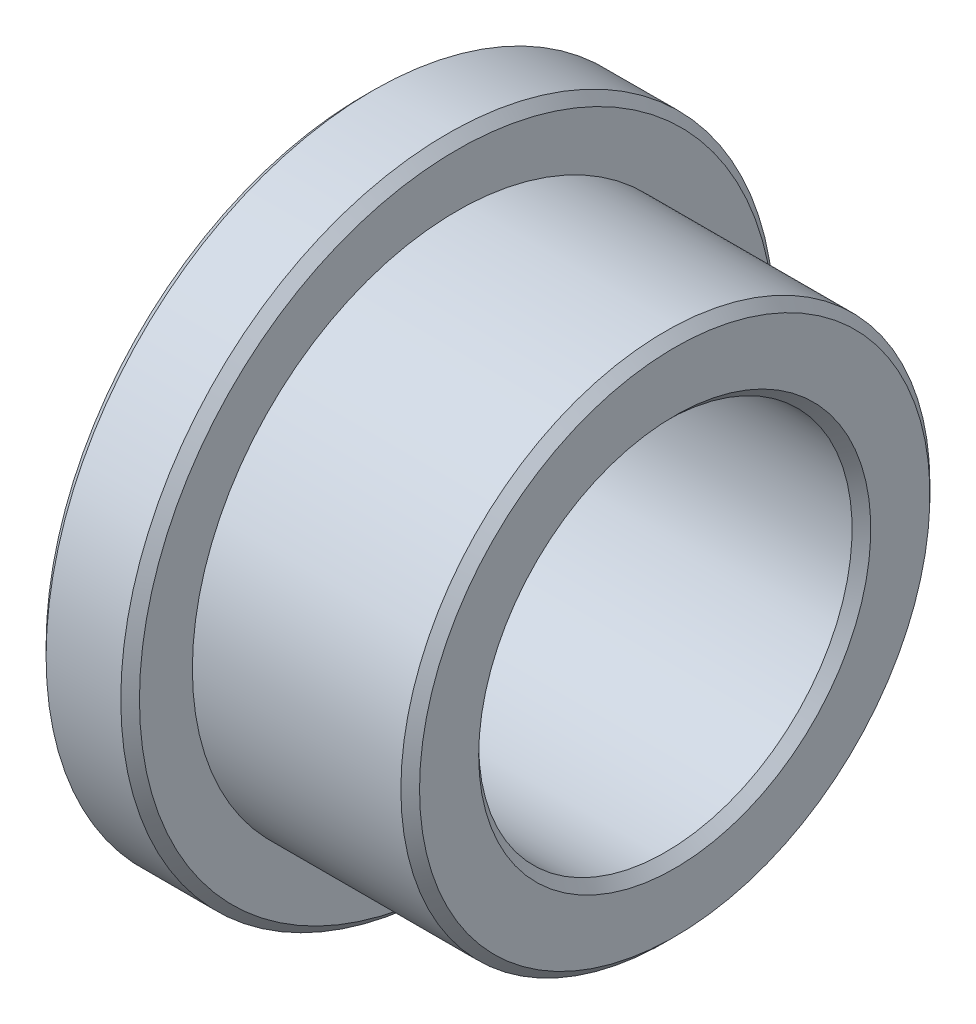
ISO-10303-21;
HEADER;
FILE_DESCRIPTION(('STEP AP214'),'2;1');
FILE_NAME('part.step','',(''),(''),'','','');
FILE_SCHEMA(('AUTOMOTIVE_DESIGN { 1 0 10303 214 1 1 1 1 }'));
ENDSEC;
DATA;
#1=APPLICATION_CONTEXT('core data for automotive mechanical design processes');
#2=APPLICATION_PROTOCOL_DEFINITION('international standard','automotive_design',2000,#1);
#3=PRODUCT_CONTEXT('',#1,'mechanical');
#4=PRODUCT('Part','Part','',(#3));
#5=PRODUCT_RELATED_PRODUCT_CATEGORY('part','',(#4));
#6=PRODUCT_DEFINITION_FORMATION('','',#4);
#7=PRODUCT_DEFINITION_CONTEXT('part definition',#1,'design');
#8=PRODUCT_DEFINITION('design','',#6,#7);
#9=PRODUCT_DEFINITION_SHAPE('','',#8);
#10=(LENGTH_UNIT() NAMED_UNIT(*) SI_UNIT(.MILLI.,.METRE.));
#11=(NAMED_UNIT(*) PLANE_ANGLE_UNIT() SI_UNIT($,.RADIAN.));
#12=(NAMED_UNIT(*) SI_UNIT($,.STERADIAN.) SOLID_ANGLE_UNIT());
#13=UNCERTAINTY_MEASURE_WITH_UNIT(LENGTH_MEASURE(1.E-05),#10,'distance_accuracy_value','');
#14=(GEOMETRIC_REPRESENTATION_CONTEXT(3) GLOBAL_UNCERTAINTY_ASSIGNED_CONTEXT((#13)) GLOBAL_UNIT_ASSIGNED_CONTEXT((#10,
#11,#12)) REPRESENTATION_CONTEXT('',''));
#15=CARTESIAN_POINT('',(0.,0.,0.));
#16=DIRECTION('',(0.,0.,1.));
#17=DIRECTION('',(1.,0.,0.));
#18=AXIS2_PLACEMENT_3D('',#15,#16,#17);
#19=CARTESIAN_POINT('',(0.,0.,0.));
#20=DIRECTION('',(-1.,0.,0.));
#21=DIRECTION('',(0.,0.,1.));
#22=AXIS2_PLACEMENT_3D('',#19,#20,#21);
#23=CYLINDRICAL_SURFACE('',#22,6.);
#24=CARTESIAN_POINT('',(0.299999999999994,0.,0.));
#25=DIRECTION('',(1.,0.,0.));
#26=DIRECTION('',(0.,0.,-1.));
#27=AXIS2_PLACEMENT_3D('',#24,#25,#26);
#28=CIRCLE('',#27,6.);
#29=CARTESIAN_POINT('',(0.299999999999994,0.,-6.));
#30=VERTEX_POINT('',#29);
#31=EDGE_CURVE('E59',#30,#30,#28,.F.);
#32=ORIENTED_EDGE('',*,*,#31,.T.);
#33=EDGE_LOOP('',(#32));
#34=FACE_BOUND('',#33,.T.);
#35=CARTESIAN_POINT('',(9.7,0.,0.));
#36=DIRECTION('',(-1.,0.,0.));
#37=DIRECTION('',(0.,0.,1.));
#38=AXIS2_PLACEMENT_3D('',#35,#36,#37);
#39=CIRCLE('',#38,6.);
#40=CARTESIAN_POINT('',(9.7,0.,6.));
#41=VERTEX_POINT('',#40);
#42=EDGE_CURVE('E62',#41,#41,#39,.F.);
#43=ORIENTED_EDGE('',*,*,#42,.T.);
#44=EDGE_LOOP('',(#43));
#45=FACE_BOUND('',#44,.T.);
#46=ADVANCED_FACE('F35',(#34,#45),#23,.F.);
#47=CARTESIAN_POINT('',(0.,6.,0.));
#48=DIRECTION('',(1.,0.,0.));
#49=DIRECTION('',(0.,0.,-1.));
#50=AXIS2_PLACEMENT_3D('',#47,#48,#49);
#51=PLANE('',#50);
#52=CARTESIAN_POINT('',(0.,0.,0.));
#53=DIRECTION('',(1.,0.,0.));
#54=DIRECTION('',(0.,0.,-1.));
#55=AXIS2_PLACEMENT_3D('',#52,#53,#54);
#56=CIRCLE('',#55,6.29999999999999);
#57=CARTESIAN_POINT('',(0.,0.,-6.29999999999999));
#58=VERTEX_POINT('',#57);
#59=EDGE_CURVE('E51',#58,#58,#56,.T.);
#60=ORIENTED_EDGE('',*,*,#59,.T.);
#61=EDGE_LOOP('',(#60));
#62=FACE_BOUND('',#61,.T.);
#63=CARTESIAN_POINT('',(0.,0.,0.));
#64=DIRECTION('',(1.,0.,0.));
#65=DIRECTION('',(0.,0.,-1.));
#66=AXIS2_PLACEMENT_3D('',#63,#64,#65);
#67=CIRCLE('',#66,10.2);
#68=CARTESIAN_POINT('',(0.,0.,-10.2));
#69=VERTEX_POINT('',#68);
#70=EDGE_CURVE('E56',#69,#69,#67,.F.);
#71=ORIENTED_EDGE('',*,*,#70,.T.);
#72=EDGE_LOOP('',(#71));
#73=FACE_BOUND('',#72,.T.);
#74=ADVANCED_FACE('F95',(#62,#73),#51,.F.);
#75=CARTESIAN_POINT('',(0.,0.,0.));
#76=DIRECTION('',(-1.,0.,0.));
#77=DIRECTION('',(0.,0.,1.));
#78=AXIS2_PLACEMENT_3D('',#75,#76,#77);
#79=CYLINDRICAL_SURFACE('',#78,10.5);
#80=CARTESIAN_POINT('',(2.70000000000001,0.,0.));
#81=DIRECTION('',(-1.,0.,0.));
#82=DIRECTION('',(0.,0.,1.));
#83=AXIS2_PLACEMENT_3D('',#80,#81,#82);
#84=CIRCLE('',#83,10.5);
#85=CARTESIAN_POINT('',(2.70000000000001,0.,10.5));
#86=VERTEX_POINT('',#85);
#87=EDGE_CURVE('E43',#86,#86,#84,.T.);
#88=ORIENTED_EDGE('',*,*,#87,.T.);
#89=EDGE_LOOP('',(#88));
#90=FACE_BOUND('',#89,.T.);
#91=CARTESIAN_POINT('',(0.300000000000005,0.,0.));
#92=DIRECTION('',(1.,0.,0.));
#93=DIRECTION('',(0.,0.,-1.));
#94=AXIS2_PLACEMENT_3D('',#91,#92,#93);
#95=CIRCLE('',#94,10.5);
#96=CARTESIAN_POINT('',(0.300000000000005,0.,-10.5));
#97=VERTEX_POINT('',#96);
#98=EDGE_CURVE('E47',#97,#97,#95,.T.);
#99=ORIENTED_EDGE('',*,*,#98,.T.);
#100=EDGE_LOOP('',(#99));
#101=FACE_BOUND('',#100,.T.);
#102=ADVANCED_FACE('F92',(#90,#101),#79,.T.);
#103=CARTESIAN_POINT('',(3.,10.5,0.));
#104=DIRECTION('',(-1.,0.,0.));
#105=DIRECTION('',(0.,0.,1.));
#106=AXIS2_PLACEMENT_3D('',#103,#104,#105);
#107=PLANE('',#106);
#108=CARTESIAN_POINT('',(3.,0.,0.));
#109=DIRECTION('',(-1.,0.,0.));
#110=DIRECTION('',(0.,0.,1.));
#111=AXIS2_PLACEMENT_3D('',#108,#109,#110);
#112=CIRCLE('',#111,10.2);
#113=CARTESIAN_POINT('',(3.,0.,10.2));
#114=VERTEX_POINT('',#113);
#115=EDGE_CURVE('E10',#114,#114,#112,.F.);
#116=ORIENTED_EDGE('',*,*,#115,.T.);
#117=EDGE_LOOP('',(#116));
#118=FACE_BOUND('',#117,.T.);
#119=CARTESIAN_POINT('',(3.,0.,0.));
#120=DIRECTION('',(-1.,0.,0.));
#121=DIRECTION('',(0.,0.,1.));
#122=AXIS2_PLACEMENT_3D('',#119,#120,#121);
#123=CIRCLE('',#122,8.5);
#124=CARTESIAN_POINT('',(3.,0.,8.5));
#125=VERTEX_POINT('',#124);
#126=EDGE_CURVE('E74',#125,#125,#123,.T.);
#127=ORIENTED_EDGE('',*,*,#126,.T.);
#128=EDGE_LOOP('',(#127));
#129=FACE_BOUND('',#128,.T.);
#130=ADVANCED_FACE('F78',(#118,#129),#107,.F.);
#131=CARTESIAN_POINT('',(0.,0.,0.));
#132=DIRECTION('',(-1.,0.,0.));
#133=DIRECTION('',(0.,0.,1.));
#134=AXIS2_PLACEMENT_3D('',#131,#132,#133);
#135=CYLINDRICAL_SURFACE('',#134,8.5);
#136=CARTESIAN_POINT('',(9.70000000000001,0.,0.));
#137=DIRECTION('',(-1.,0.,0.));
#138=DIRECTION('',(0.,0.,1.));
#139=AXIS2_PLACEMENT_3D('',#136,#137,#138);
#140=CIRCLE('',#139,8.5);
#141=CARTESIAN_POINT('',(9.70000000000001,0.,8.5));
#142=VERTEX_POINT('',#141);
#143=EDGE_CURVE('E71',#142,#142,#140,.T.);
#144=ORIENTED_EDGE('',*,*,#143,.T.);
#145=EDGE_LOOP('',(#144));
#146=FACE_BOUND('',#145,.T.);
#147=ORIENTED_EDGE('',*,*,#126,.F.);
#148=EDGE_LOOP('',(#147));
#149=FACE_BOUND('',#148,.T.);
#150=ADVANCED_FACE('F80',(#146,#149),#135,.T.);
#151=CARTESIAN_POINT('',(10.,8.5,0.));
#152=DIRECTION('',(-1.,0.,0.));
#153=DIRECTION('',(0.,0.,1.));
#154=AXIS2_PLACEMENT_3D('',#151,#152,#153);
#155=PLANE('',#154);
#156=CARTESIAN_POINT('',(10.,0.,0.));
#157=DIRECTION('',(-1.,0.,0.));
#158=DIRECTION('',(0.,0.,1.));
#159=AXIS2_PLACEMENT_3D('',#156,#157,#158);
#160=CIRCLE('',#159,8.2);
#161=CARTESIAN_POINT('',(10.,0.,8.2));
#162=VERTEX_POINT('',#161);
#163=EDGE_CURVE('E65',#162,#162,#160,.F.);
#164=ORIENTED_EDGE('',*,*,#163,.T.);
#165=EDGE_LOOP('',(#164));
#166=FACE_BOUND('',#165,.T.);
#167=CARTESIAN_POINT('',(10.,0.,0.));
#168=DIRECTION('',(-1.,0.,0.));
#169=DIRECTION('',(0.,0.,1.));
#170=AXIS2_PLACEMENT_3D('',#167,#168,#169);
#171=CIRCLE('',#170,6.3);
#172=CARTESIAN_POINT('',(10.,0.,6.3));
#173=VERTEX_POINT('',#172);
#174=EDGE_CURVE('E68',#173,#173,#171,.T.);
#175=ORIENTED_EDGE('',*,*,#174,.T.);
#176=EDGE_LOOP('',(#175));
#177=FACE_BOUND('',#176,.T.);
#178=ADVANCED_FACE('F82',(#166,#177),#155,.F.);
#179=CARTESIAN_POINT('',(9.70000000000001,0.,0.));
#180=DIRECTION('',(-1.,0.,0.));
#181=DIRECTION('',(0.,0.,1.));
#182=AXIS2_PLACEMENT_3D('',#179,#180,#181);
#183=CONICAL_SURFACE('',#182,8.5,0.785398163397451);
#184=ORIENTED_EDGE('',*,*,#163,.F.);
#185=EDGE_LOOP('',(#184));
#186=FACE_BOUND('',#185,.T.);
#187=ORIENTED_EDGE('',*,*,#143,.F.);
#188=EDGE_LOOP('',(#187));
#189=FACE_BOUND('',#188,.T.);
#190=ADVANCED_FACE('F89',(#186,#189),#183,.T.);
#191=CARTESIAN_POINT('',(0.299999999999994,0.,0.));
#192=DIRECTION('',(-1.,0.,0.));
#193=DIRECTION('',(0.,0.,1.));
#194=AXIS2_PLACEMENT_3D('',#191,#192,#193);
#195=CONICAL_SURFACE('',#194,6.,0.785398163397448);
#196=ORIENTED_EDGE('',*,*,#59,.F.);
#197=EDGE_LOOP('',(#196));
#198=FACE_BOUND('',#197,.T.);
#199=ORIENTED_EDGE('',*,*,#31,.F.);
#200=EDGE_LOOP('',(#199));
#201=FACE_BOUND('',#200,.T.);
#202=ADVANCED_FACE('F112',(#198,#201),#195,.F.);
#203=CARTESIAN_POINT('',(10.,0.,0.));
#204=DIRECTION('',(1.,0.,0.));
#205=DIRECTION('',(0.,0.,-1.));
#206=AXIS2_PLACEMENT_3D('',#203,#204,#205);
#207=CONICAL_SURFACE('',#206,6.3,0.785398163397447);
#208=ORIENTED_EDGE('',*,*,#42,.F.);
#209=EDGE_LOOP('',(#208));
#210=FACE_BOUND('',#209,.T.);
#211=ORIENTED_EDGE('',*,*,#174,.F.);
#212=EDGE_LOOP('',(#211));
#213=FACE_BOUND('',#212,.T.);
#214=ADVANCED_FACE('F119',(#210,#213),#207,.F.);
#215=CARTESIAN_POINT('',(2.70000000000001,0.,0.));
#216=DIRECTION('',(-1.,0.,0.));
#217=DIRECTION('',(0.,0.,1.));
#218=AXIS2_PLACEMENT_3D('',#215,#216,#217);
#219=CONICAL_SURFACE('',#218,10.5,0.785398163397454);
#220=ORIENTED_EDGE('',*,*,#115,.F.);
#221=EDGE_LOOP('',(#220));
#222=FACE_BOUND('',#221,.T.);
#223=ORIENTED_EDGE('',*,*,#87,.F.);
#224=EDGE_LOOP('',(#223));
#225=FACE_BOUND('',#224,.T.);
#226=ADVANCED_FACE('F125',(#222,#225),#219,.T.);
#227=CARTESIAN_POINT('',(0.,0.,0.));
#228=DIRECTION('',(1.,0.,0.));
#229=DIRECTION('',(0.,0.,-1.));
#230=AXIS2_PLACEMENT_3D('',#227,#228,#229);
#231=CONICAL_SURFACE('',#230,10.2,0.785398163397443);
#232=CARTESIAN_POINT('',(0.300000000000005,0.,-10.5));
#233=CARTESIAN_POINT('',(0.296875000000006,0.,-10.496875));
#234=CARTESIAN_POINT('',(0.293750000000005,0.,-10.49375));
#235=CARTESIAN_POINT('',(0.287500000000005,0.,-10.4875));
#236=CARTESIAN_POINT('',(0.284375000000005,0.,-10.484375));
#237=CARTESIAN_POINT('',(0.278125000000005,0.,-10.478125));
#238=CARTESIAN_POINT('',(0.275000000000005,0.,-10.475));
#239=CARTESIAN_POINT('',(0.268750000000005,0.,-10.46875));
#240=CARTESIAN_POINT('',(0.265625000000004,0.,-10.465625));
#241=CARTESIAN_POINT('',(0.259375000000004,0.,-10.459375));
#242=CARTESIAN_POINT('',(0.256250000000004,0.,-10.45625));
#243=CARTESIAN_POINT('',(0.250000000000004,0.,-10.45));
#244=CARTESIAN_POINT('',(0.246875000000004,0.,-10.446875));
#245=CARTESIAN_POINT('',(0.240625000000004,0.,-10.440625));
#246=CARTESIAN_POINT('',(0.237500000000004,0.,-10.4375));
#247=CARTESIAN_POINT('',(0.231250000000004,0.,-10.43125));
#248=CARTESIAN_POINT('',(0.228125000000004,0.,-10.428125));
#249=CARTESIAN_POINT('',(0.221875000000004,0.,-10.421875));
#250=CARTESIAN_POINT('',(0.218750000000004,0.,-10.41875));
#251=CARTESIAN_POINT('',(0.212500000000004,0.,-10.4125));
#252=CARTESIAN_POINT('',(0.209375000000003,0.,-10.409375));
#253=CARTESIAN_POINT('',(0.203125000000003,0.,-10.403125));
#254=CARTESIAN_POINT('',(0.200000000000004,0.,-10.4));
#255=CARTESIAN_POINT('',(0.193750000000004,0.,-10.39375));
#256=CARTESIAN_POINT('',(0.190625000000003,0.,-10.390625));
#257=CARTESIAN_POINT('',(0.184375000000003,0.,-10.384375));
#258=CARTESIAN_POINT('',(0.181250000000003,0.,-10.38125));
#259=CARTESIAN_POINT('',(0.175000000000003,0.,-10.375));
#260=CARTESIAN_POINT('',(0.171875000000003,0.,-10.371875));
#261=CARTESIAN_POINT('',(0.165625000000003,0.,-10.365625));
#262=CARTESIAN_POINT('',(0.162500000000003,0.,-10.3625));
#263=CARTESIAN_POINT('',(0.156250000000002,0.,-10.35625));
#264=CARTESIAN_POINT('',(0.153125000000003,0.,-10.353125));
#265=CARTESIAN_POINT('',(0.146875000000003,0.,-10.346875));
#266=CARTESIAN_POINT('',(0.143750000000003,0.,-10.34375));
#267=CARTESIAN_POINT('',(0.137500000000002,0.,-10.3375));
#268=CARTESIAN_POINT('',(0.134375000000002,0.,-10.334375));
#269=CARTESIAN_POINT('',(0.128125000000002,0.,-10.328125));
#270=CARTESIAN_POINT('',(0.125000000000002,0.,-10.325));
#271=CARTESIAN_POINT('',(0.118750000000002,0.,-10.31875));
#272=CARTESIAN_POINT('',(0.115625000000002,0.,-10.315625));
#273=CARTESIAN_POINT('',(0.109375000000002,0.,-10.309375));
#274=CARTESIAN_POINT('',(0.106250000000002,0.,-10.30625));
#275=CARTESIAN_POINT('',(0.100000000000002,0.,-10.3));
#276=CARTESIAN_POINT('',(0.0968750000000019,0.,-10.296875));
#277=CARTESIAN_POINT('',(0.0906250000000017,0.,-10.290625));
#278=CARTESIAN_POINT('',(0.0875000000000014,0.,-10.2875));
#279=CARTESIAN_POINT('',(0.0812500000000012,0.,-10.28125));
#280=CARTESIAN_POINT('',(0.0781250000000012,0.,-10.278125));
#281=CARTESIAN_POINT('',(0.0718750000000013,0.,-10.271875));
#282=CARTESIAN_POINT('',(0.0687500000000014,0.,-10.26875));
#283=CARTESIAN_POINT('',(0.0625000000000012,0.,-10.2625));
#284=CARTESIAN_POINT('',(0.0593750000000009,0.,-10.259375));
#285=CARTESIAN_POINT('',(0.0531250000000007,0.,-10.253125));
#286=CARTESIAN_POINT('',(0.0500000000000008,0.,-10.25));
#287=CARTESIAN_POINT('',(0.0437500000000008,0.,-10.24375));
#288=CARTESIAN_POINT('',(0.0406250000000009,0.,-10.240625));
#289=CARTESIAN_POINT('',(0.0343750000000007,0.,-10.234375));
#290=CARTESIAN_POINT('',(0.0312500000000004,0.,-10.23125));
#291=CARTESIAN_POINT('',(0.0250000000000003,0.,-10.225));
#292=CARTESIAN_POINT('',(0.0218750000000005,0.,-10.221875));
#293=CARTESIAN_POINT('',(0.0156250000000004,0.,-10.215625));
#294=CARTESIAN_POINT('',(0.0125000000000002,0.,-10.2125));
#295=CARTESIAN_POINT('',(0.0062499999999998,0.,-10.20625));
#296=CARTESIAN_POINT('',(0.00312499999999958,0.,-10.203125));
#297=CARTESIAN_POINT('',(0.,0.,-10.2));
#298=B_SPLINE_CURVE_WITH_KNOTS('',3,(#232,#233,#234,#235,#236,#237,#238,#239,#240,#241,#242,
#243,#244,#245,#246,#247,#248,#249,#250,#251,#252,#253,#254,#255,#256,#257,#258,#259,#260,#261,
#262,#263,#264,#265,#266,#267,#268,#269,#270,#271,#272,#273,#274,#275,#276,#277,#278,#279,#280,
#281,#282,#283,#284,#285,#286,#287,#288,#289,#290,#291,#292,#293,#294,#295,#296,#297),
.UNSPECIFIED.,.F.,.F.,(4,2,2,2,2,2,2,2,2,2,2,2,2,2,2,2,2,2,2,2,2,2,2,2,2,2,2,2,2,2,2,2,4),(0.,
0.0132582521472484,0.0265165042944955,0.0397747564417439,0.053033008588991,0.0662912607362394,
0.0795495128834878,0.092807765030735,0.106066017177983,0.119324269325232,0.132582521472479,
0.145840773619727,0.159099025766974,0.172357277914223,0.185615530061471,0.198873782208718,
0.212132034355967,0.225390286503215,0.238648538650462,0.251906790797711,0.265165042944958,
0.278423295092206,0.291681547239454,0.304939799386702,0.31819805153395,0.331456303681198,
0.344714555828446,0.357972807975694,0.371231060122942,0.384489312270189,0.397747564417438,
0.411005816564685,0.424264068711933),.UNSPECIFIED.);
#299=EDGE_CURVE('BSEAM38',#97,#69,#298,.T.);
#300=ORIENTED_EDGE('',*,*,#98,.F.);
#301=ORIENTED_EDGE('',*,*,#70,.F.);
#302=ORIENTED_EDGE('',*,*,#299,.T.);
#303=ORIENTED_EDGE('',*,*,#299,.F.);
#304=EDGE_LOOP('',(#300,#302,#301,#303));
#305=FACE_BOUND('',#304,.T.);
#306=ADVANCED_FACE('F38',(#305),#231,.T.);
#307=CLOSED_SHELL('',(#46,#74,#102,#130,#150,#178,#190,#202,#214,#226,#306));
#308=MANIFOLD_SOLID_BREP('B2',#307);
#309=ADVANCED_BREP_SHAPE_REPRESENTATION('',(#18,#308),#14);
#310=SHAPE_DEFINITION_REPRESENTATION(#9,#309);
ENDSEC;
END-ISO-10303-21;
